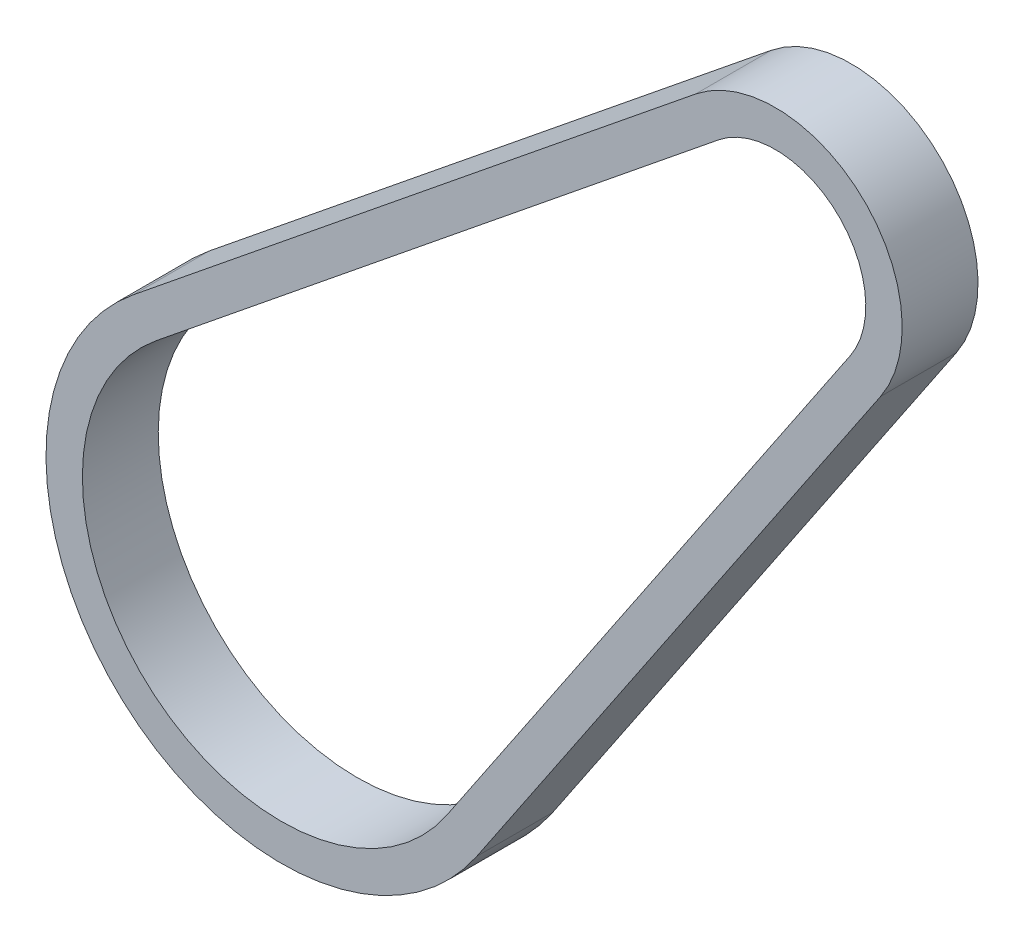
ISO-10303-21;
HEADER;
FILE_DESCRIPTION(('STEP AP214'),'2;1');
FILE_NAME('part.step','',(''),(''),'','','');
FILE_SCHEMA(('AUTOMOTIVE_DESIGN { 1 0 10303 214 1 1 1 1 }'));
ENDSEC;
DATA;
#1=APPLICATION_CONTEXT('core data for automotive mechanical design processes');
#2=APPLICATION_PROTOCOL_DEFINITION('international standard','automotive_design',2000,#1);
#3=PRODUCT_CONTEXT('',#1,'mechanical');
#4=PRODUCT('Part','Part','',(#3));
#5=PRODUCT_RELATED_PRODUCT_CATEGORY('part','',(#4));
#6=PRODUCT_DEFINITION_FORMATION('','',#4);
#7=PRODUCT_DEFINITION_CONTEXT('part definition',#1,'design');
#8=PRODUCT_DEFINITION('design','',#6,#7);
#9=PRODUCT_DEFINITION_SHAPE('','',#8);
#10=(LENGTH_UNIT() NAMED_UNIT(*) SI_UNIT(.MILLI.,.METRE.));
#11=(NAMED_UNIT(*) PLANE_ANGLE_UNIT() SI_UNIT($,.RADIAN.));
#12=(NAMED_UNIT(*) SI_UNIT($,.STERADIAN.) SOLID_ANGLE_UNIT());
#13=UNCERTAINTY_MEASURE_WITH_UNIT(LENGTH_MEASURE(1.E-05),#10,'distance_accuracy_value','');
#14=(GEOMETRIC_REPRESENTATION_CONTEXT(3) GLOBAL_UNCERTAINTY_ASSIGNED_CONTEXT((#13)) GLOBAL_UNIT_ASSIGNED_CONTEXT((#10,
#11,#12)) REPRESENTATION_CONTEXT('',''));
#15=CARTESIAN_POINT('',(0.,0.,0.));
#16=DIRECTION('',(0.,0.,1.));
#17=DIRECTION('',(1.,0.,0.));
#18=AXIS2_PLACEMENT_3D('',#15,#16,#17);
#19=CARTESIAN_POINT('',(32.5605341066476,35.5626399486558,-5.));
#20=DIRECTION('',(0.,0.,1.));
#21=DIRECTION('',(1.,0.,0.));
#22=AXIS2_PLACEMENT_3D('',#19,#20,#21);
#23=CYLINDRICAL_SURFACE('',#22,8.36197243913529);
#24=CARTESIAN_POINT('',(32.5605341066476,35.5626399486558,0.));
#25=DIRECTION('',(0.,0.,-1.));
#26=DIRECTION('',(-1.,0.,0.));
#27=AXIS2_PLACEMENT_3D('',#24,#25,#26);
#28=CIRCLE('',#27,8.36197243913529);
#29=CARTESIAN_POINT('',(39.4982573316344,30.894601867584,0.));
#30=VERTEX_POINT('',#29);
#31=CARTESIAN_POINT('',(27.3003031684193,42.0628363725621,0.));
#32=VERTEX_POINT('',#31);
#33=EDGE_CURVE('E157',#30,#32,#28,.F.);
#34=ORIENTED_EDGE('',*,*,#33,.F.);
#35=DIRECTION('',(0.,0.,1.));
#36=VECTOR('',#35,1.);
#37=CARTESIAN_POINT('',(39.4982573316344,30.894601867584,-5.));
#38=LINE('',#37,#36);
#39=CARTESIAN_POINT('',(39.4982573316344,30.894601867584,-5.));
#40=VERTEX_POINT('',#39);
#41=EDGE_CURVE('E12',#40,#30,#38,.T.);
#42=ORIENTED_EDGE('',*,*,#41,.F.);
#43=CARTESIAN_POINT('',(32.5605341066476,35.5626399486558,-5.));
#44=DIRECTION('',(0.,0.,-1.));
#45=DIRECTION('',(-1.,0.,0.));
#46=AXIS2_PLACEMENT_3D('',#43,#44,#45);
#47=CIRCLE('',#46,8.36197243913529);
#48=CARTESIAN_POINT('',(27.3003031684193,42.0628363725621,-5.));
#49=VERTEX_POINT('',#48);
#50=EDGE_CURVE('E161',#40,#49,#47,.F.);
#51=ORIENTED_EDGE('',*,*,#50,.T.);
#52=DIRECTION('',(0.,0.,1.));
#53=VECTOR('',#52,1.);
#54=CARTESIAN_POINT('',(27.3003031684193,42.0628363725621,-5.));
#55=LINE('',#54,#53);
#56=EDGE_CURVE('E62',#49,#32,#55,.T.);
#57=ORIENTED_EDGE('',*,*,#56,.T.);
#58=EDGE_LOOP('',(#34,#42,#51,#57));
#59=FACE_BOUND('',#58,.T.);
#60=ADVANCED_FACE('F59',(#59),#23,.T.);
#61=CARTESIAN_POINT('',(39.4982573316344,30.894601867584,-5.));
#62=DIRECTION('',(0.829675447447933,-0.558246049607225,0.));
#63=DIRECTION('',(0.558246049607225,0.829675447447933,0.));
#64=AXIS2_PLACEMENT_3D('',#61,#62,#63);
#65=PLANE('',#64);
#66=DIRECTION('',(0.558246049607225,0.829675447447933,0.));
#67=VECTOR('',#66,1.);
#68=CARTESIAN_POINT('',(39.4982573316344,30.894601867584,0.));
#69=LINE('',#68,#67);
#70=CARTESIAN_POINT('',(12.8798359130362,-8.66618090261487,0.));
#71=VERTEX_POINT('',#70);
#72=EDGE_CURVE('E165',#71,#30,#69,.T.);
#73=ORIENTED_EDGE('',*,*,#72,.F.);
#74=DIRECTION('',(0.,0.,1.));
#75=VECTOR('',#74,1.);
#76=CARTESIAN_POINT('',(12.8798359130362,-8.66618090261487,-5.));
#77=LINE('',#76,#75);
#78=CARTESIAN_POINT('',(12.8798359130362,-8.66618090261487,-5.));
#79=VERTEX_POINT('',#78);
#80=EDGE_CURVE('E67',#79,#71,#77,.T.);
#81=ORIENTED_EDGE('',*,*,#80,.F.);
#82=DIRECTION('',(0.558246049607225,0.829675447447933,0.));
#83=VECTOR('',#82,1.);
#84=CARTESIAN_POINT('',(39.4982573316344,30.894601867584,-5.));
#85=LINE('',#84,#83);
#86=EDGE_CURVE('E171',#79,#40,#85,.T.);
#87=ORIENTED_EDGE('',*,*,#86,.T.);
#88=ORIENTED_EDGE('',*,*,#41,.T.);
#89=EDGE_LOOP('',(#73,#81,#87,#88));
#90=FACE_BOUND('',#89,.T.);
#91=ADVANCED_FACE('F197',(#90),#65,.T.);
#92=CARTESIAN_POINT('',(0.,0.,-5.));
#93=DIRECTION('',(0.,0.,1.));
#94=DIRECTION('',(1.,0.,0.));
#95=AXIS2_PLACEMENT_3D('',#92,#93,#94);
#96=CYLINDRICAL_SURFACE('',#95,15.5239448782706);
#97=CARTESIAN_POINT('',(0.,0.,0.));
#98=DIRECTION('',(0.,0.,-1.));
#99=DIRECTION('',(-1.,0.,0.));
#100=AXIS2_PLACEMENT_3D('',#97,#98,#99);
#101=CIRCLE('',#100,15.5239448782706);
#102=CARTESIAN_POINT('',(-9.76558290838777,12.0675703869084,0.));
#103=VERTEX_POINT('',#102);
#104=EDGE_CURVE('E179',#103,#71,#101,.F.);
#105=ORIENTED_EDGE('',*,*,#104,.F.);
#106=DIRECTION('',(0.,0.,1.));
#107=VECTOR('',#106,1.);
#108=CARTESIAN_POINT('',(-9.76558290838777,12.0675703869084,-5.));
#109=LINE('',#108,#107);
#110=CARTESIAN_POINT('',(-9.76558290838777,12.0675703869084,-5.));
#111=VERTEX_POINT('',#110);
#112=EDGE_CURVE('E184',#111,#103,#109,.T.);
#113=ORIENTED_EDGE('',*,*,#112,.F.);
#114=CARTESIAN_POINT('',(0.,0.,-5.));
#115=DIRECTION('',(0.,0.,-1.));
#116=DIRECTION('',(-1.,0.,0.));
#117=AXIS2_PLACEMENT_3D('',#114,#115,#116);
#118=CIRCLE('',#117,15.5239448782706);
#119=EDGE_CURVE('E168',#111,#79,#118,.F.);
#120=ORIENTED_EDGE('',*,*,#119,.T.);
#121=ORIENTED_EDGE('',*,*,#80,.T.);
#122=EDGE_LOOP('',(#105,#113,#120,#121));
#123=FACE_BOUND('',#122,.T.);
#124=ADVANCED_FACE('F201',(#123),#96,.T.);
#125=CARTESIAN_POINT('',(27.3003031684193,42.0628363725621,-5.));
#126=DIRECTION('',(-0.629065806723973,0.777352050753529,0.));
#127=DIRECTION('',(-0.777352050753529,-0.629065806723973,0.));
#128=AXIS2_PLACEMENT_3D('',#125,#126,#127);
#129=PLANE('',#128);
#130=DIRECTION('',(-0.777352050753529,-0.629065806723973,0.));
#131=VECTOR('',#130,1.);
#132=CARTESIAN_POINT('',(27.3003031684193,42.0628363725621,0.));
#133=LINE('',#132,#131);
#134=EDGE_CURVE('E176',#32,#103,#133,.T.);
#135=ORIENTED_EDGE('',*,*,#134,.F.);
#136=ORIENTED_EDGE('',*,*,#56,.F.);
#137=DIRECTION('',(-0.777352050753529,-0.629065806723973,0.));
#138=VECTOR('',#137,1.);
#139=CARTESIAN_POINT('',(27.3003031684193,42.0628363725621,-5.));
#140=LINE('',#139,#138);
#141=EDGE_CURVE('E164',#49,#111,#140,.T.);
#142=ORIENTED_EDGE('',*,*,#141,.T.);
#143=ORIENTED_EDGE('',*,*,#112,.T.);
#144=EDGE_LOOP('',(#135,#136,#142,#143));
#145=FACE_BOUND('',#144,.T.);
#146=ADVANCED_FACE('F192',(#145),#129,.T.);
#147=CARTESIAN_POINT('',(32.5605341066476,35.5626399486558,-5.));
#148=DIRECTION('',(0.,0.,-1.));
#149=DIRECTION('',(-1.,0.,0.));
#150=AXIS2_PLACEMENT_3D('',#147,#148,#149);
#151=PLANE('',#150);
#152=CARTESIAN_POINT('',(32.5605341066476,35.5626399486558,-5.));
#153=DIRECTION('',(0.,0.,-1.));
#154=DIRECTION('',(-1.,0.,0.));
#155=AXIS2_PLACEMENT_3D('',#152,#153,#154);
#156=CIRCLE('',#155,5.96197243913529);
#157=CARTESIAN_POINT('',(37.5070362577594,32.2343923866414,-5.));
#158=VERTEX_POINT('',#157);
#159=CARTESIAN_POINT('',(28.8100611045568,40.1971914507536,-5.));
#160=VERTEX_POINT('',#159);
#161=EDGE_CURVE('E126',#158,#160,#156,.F.);
#162=ORIENTED_EDGE('',*,*,#161,.T.);
#163=DIRECTION('',(-0.777352050753529,-0.629065806723973,0.));
#164=VECTOR('',#163,1.);
#165=CARTESIAN_POINT('',(28.8100611045568,40.1971914507536,-5.));
#166=LINE('',#165,#164);
#167=CARTESIAN_POINT('',(-8.25582497225023,10.2019254650999,-5.));
#168=VERTEX_POINT('',#167);
#169=EDGE_CURVE('E135',#160,#168,#166,.T.);
#170=ORIENTED_EDGE('',*,*,#169,.T.);
#171=CARTESIAN_POINT('',(0.,0.,-5.));
#172=DIRECTION('',(0.,0.,-1.));
#173=DIRECTION('',(-1.,0.,0.));
#174=AXIS2_PLACEMENT_3D('',#171,#172,#173);
#175=CIRCLE('',#174,13.1239448782706);
#176=CARTESIAN_POINT('',(10.8886148391612,-7.32639038355753,-5.));
#177=VERTEX_POINT('',#176);
#178=EDGE_CURVE('E75',#168,#177,#175,.F.);
#179=ORIENTED_EDGE('',*,*,#178,.T.);
#180=DIRECTION('',(0.558246049607225,0.829675447447933,0.));
#181=VECTOR('',#180,1.);
#182=CARTESIAN_POINT('',(37.5070362577594,32.2343923866414,-5.));
#183=LINE('',#182,#181);
#184=EDGE_CURVE('E132',#177,#158,#183,.T.);
#185=ORIENTED_EDGE('',*,*,#184,.T.);
#186=EDGE_LOOP('',(#162,#170,#179,#185));
#187=FACE_BOUND('',#186,.T.);
#188=ORIENTED_EDGE('',*,*,#50,.F.);
#189=ORIENTED_EDGE('',*,*,#86,.F.);
#190=ORIENTED_EDGE('',*,*,#119,.F.);
#191=ORIENTED_EDGE('',*,*,#141,.F.);
#192=EDGE_LOOP('',(#188,#189,#190,#191));
#193=FACE_BOUND('',#192,.T.);
#194=ADVANCED_FACE('F139',(#187,#193),#151,.T.);
#195=CARTESIAN_POINT('',(32.5605341066476,35.5626399486558,0.));
#196=DIRECTION('',(0.,0.,-1.));
#197=DIRECTION('',(-1.,0.,0.));
#198=AXIS2_PLACEMENT_3D('',#195,#196,#197);
#199=PLANE('',#198);
#200=DIRECTION('',(-0.777352050753529,-0.629065806723973,0.));
#201=VECTOR('',#200,1.);
#202=CARTESIAN_POINT('',(28.8100611045568,40.1971914507536,0.));
#203=LINE('',#202,#201);
#204=CARTESIAN_POINT('',(28.8100611045568,40.1971914507536,0.));
#205=VERTEX_POINT('',#204);
#206=CARTESIAN_POINT('',(-8.25582497225023,10.2019254650999,0.));
#207=VERTEX_POINT('',#206);
#208=EDGE_CURVE('E151',#205,#207,#203,.T.);
#209=ORIENTED_EDGE('',*,*,#208,.F.);
#210=CARTESIAN_POINT('',(32.5605341066476,35.5626399486558,0.));
#211=DIRECTION('',(0.,0.,-1.));
#212=DIRECTION('',(-1.,0.,0.));
#213=AXIS2_PLACEMENT_3D('',#210,#211,#212);
#214=CIRCLE('',#213,5.96197243913529);
#215=CARTESIAN_POINT('',(37.5070362577594,32.2343923866414,0.));
#216=VERTEX_POINT('',#215);
#217=EDGE_CURVE('E83',#216,#205,#214,.F.);
#218=ORIENTED_EDGE('',*,*,#217,.F.);
#219=DIRECTION('',(0.558246049607225,0.829675447447933,0.));
#220=VECTOR('',#219,1.);
#221=CARTESIAN_POINT('',(37.5070362577594,32.2343923866414,0.));
#222=LINE('',#221,#220);
#223=CARTESIAN_POINT('',(10.8886148391612,-7.32639038355753,0.));
#224=VERTEX_POINT('',#223);
#225=EDGE_CURVE('E142',#224,#216,#222,.T.);
#226=ORIENTED_EDGE('',*,*,#225,.F.);
#227=CARTESIAN_POINT('',(0.,0.,0.));
#228=DIRECTION('',(0.,0.,-1.));
#229=DIRECTION('',(-1.,0.,0.));
#230=AXIS2_PLACEMENT_3D('',#227,#228,#229);
#231=CIRCLE('',#230,13.1239448782706);
#232=EDGE_CURVE('E145',#207,#224,#231,.F.);
#233=ORIENTED_EDGE('',*,*,#232,.F.);
#234=EDGE_LOOP('',(#209,#218,#226,#233));
#235=FACE_BOUND('',#234,.T.);
#236=ORIENTED_EDGE('',*,*,#33,.T.);
#237=ORIENTED_EDGE('',*,*,#134,.T.);
#238=ORIENTED_EDGE('',*,*,#104,.T.);
#239=ORIENTED_EDGE('',*,*,#72,.T.);
#240=EDGE_LOOP('',(#236,#237,#238,#239));
#241=FACE_BOUND('',#240,.T.);
#242=ADVANCED_FACE('F194',(#235,#241),#199,.F.);
#243=CARTESIAN_POINT('',(32.5605341066476,35.5626399486558,-5.));
#244=DIRECTION('',(0.,0.,1.));
#245=DIRECTION('',(1.,0.,0.));
#246=AXIS2_PLACEMENT_3D('',#243,#244,#245);
#247=CYLINDRICAL_SURFACE('',#246,5.96197243913529);
#248=ORIENTED_EDGE('',*,*,#217,.T.);
#249=DIRECTION('',(0.,0.,1.));
#250=VECTOR('',#249,1.);
#251=CARTESIAN_POINT('',(28.8100611045568,40.1971914507536,-5.));
#252=LINE('',#251,#250);
#253=EDGE_CURVE('E122',#160,#205,#252,.T.);
#254=ORIENTED_EDGE('',*,*,#253,.F.);
#255=ORIENTED_EDGE('',*,*,#161,.F.);
#256=DIRECTION('',(0.,0.,1.));
#257=VECTOR('',#256,1.);
#258=CARTESIAN_POINT('',(37.5070362577594,32.2343923866414,-5.));
#259=LINE('',#258,#257);
#260=EDGE_CURVE('E155',#158,#216,#259,.T.);
#261=ORIENTED_EDGE('',*,*,#260,.T.);
#262=EDGE_LOOP('',(#248,#254,#255,#261));
#263=FACE_BOUND('',#262,.T.);
#264=ADVANCED_FACE('F124',(#263),#247,.F.);
#265=CARTESIAN_POINT('',(37.5070362577594,32.2343923866414,-5.));
#266=DIRECTION('',(0.829675447447933,-0.558246049607225,0.));
#267=DIRECTION('',(0.558246049607225,0.829675447447933,0.));
#268=AXIS2_PLACEMENT_3D('',#265,#266,#267);
#269=PLANE('',#268);
#270=ORIENTED_EDGE('',*,*,#225,.T.);
#271=ORIENTED_EDGE('',*,*,#260,.F.);
#272=ORIENTED_EDGE('',*,*,#184,.F.);
#273=DIRECTION('',(0.,0.,1.));
#274=VECTOR('',#273,1.);
#275=CARTESIAN_POINT('',(10.8886148391612,-7.32639038355753,-5.));
#276=LINE('',#275,#274);
#277=EDGE_CURVE('E158',#177,#224,#276,.T.);
#278=ORIENTED_EDGE('',*,*,#277,.T.);
#279=EDGE_LOOP('',(#270,#271,#272,#278));
#280=FACE_BOUND('',#279,.T.);
#281=ADVANCED_FACE('F252',(#280),#269,.F.);
#282=CARTESIAN_POINT('',(0.,0.,-5.));
#283=DIRECTION('',(0.,0.,1.));
#284=DIRECTION('',(1.,0.,0.));
#285=AXIS2_PLACEMENT_3D('',#282,#283,#284);
#286=CYLINDRICAL_SURFACE('',#285,13.1239448782706);
#287=ORIENTED_EDGE('',*,*,#232,.T.);
#288=ORIENTED_EDGE('',*,*,#277,.F.);
#289=ORIENTED_EDGE('',*,*,#178,.F.);
#290=DIRECTION('',(0.,0.,1.));
#291=VECTOR('',#290,1.);
#292=CARTESIAN_POINT('',(-8.25582497225023,10.2019254650999,-5.));
#293=LINE('',#292,#291);
#294=EDGE_CURVE('E131',#168,#207,#293,.T.);
#295=ORIENTED_EDGE('',*,*,#294,.T.);
#296=EDGE_LOOP('',(#287,#288,#289,#295));
#297=FACE_BOUND('',#296,.T.);
#298=ADVANCED_FACE('F261',(#297),#286,.F.);
#299=CARTESIAN_POINT('',(28.8100611045568,40.1971914507536,-5.));
#300=DIRECTION('',(-0.629065806723973,0.777352050753529,0.));
#301=DIRECTION('',(-0.777352050753529,-0.629065806723973,0.));
#302=AXIS2_PLACEMENT_3D('',#299,#300,#301);
#303=PLANE('',#302);
#304=ORIENTED_EDGE('',*,*,#208,.T.);
#305=ORIENTED_EDGE('',*,*,#294,.F.);
#306=ORIENTED_EDGE('',*,*,#169,.F.);
#307=ORIENTED_EDGE('',*,*,#253,.T.);
#308=EDGE_LOOP('',(#304,#305,#306,#307));
#309=FACE_BOUND('',#308,.T.);
#310=ADVANCED_FACE('F136',(#309),#303,.F.);
#311=CLOSED_SHELL('',(#60,#91,#124,#146,#194,#242,#264,#281,#298,#310));
#312=MANIFOLD_SOLID_BREP('B2',#311);
#313=ADVANCED_BREP_SHAPE_REPRESENTATION('',(#18,#312),#14);
#314=SHAPE_DEFINITION_REPRESENTATION(#9,#313);
ENDSEC;
END-ISO-10303-21;
